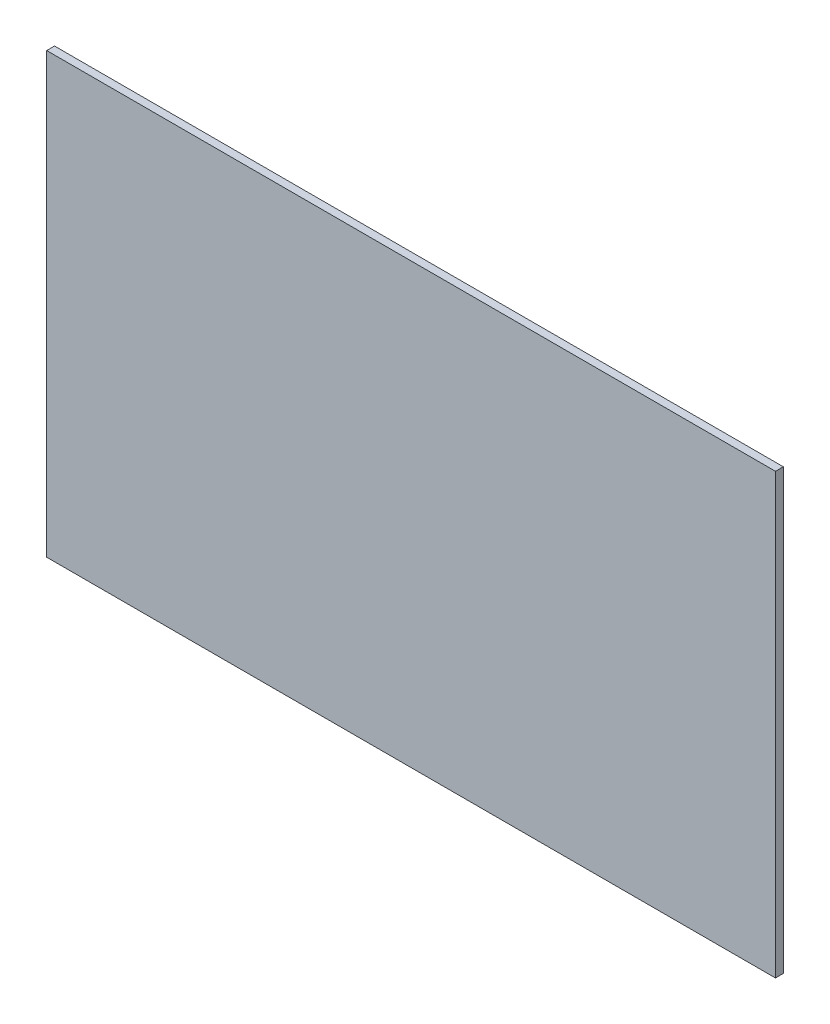
ISO-10303-21;
HEADER;
FILE_DESCRIPTION(('STEP AP214'),'2;1');
FILE_NAME('part.step','',(''),(''),'','','');
FILE_SCHEMA(('AUTOMOTIVE_DESIGN { 1 0 10303 214 1 1 1 1 }'));
ENDSEC;
DATA;
#1=APPLICATION_CONTEXT('core data for automotive mechanical design processes');
#2=APPLICATION_PROTOCOL_DEFINITION('international standard','automotive_design',2000,#1);
#3=PRODUCT_CONTEXT('',#1,'mechanical');
#4=PRODUCT('Part','Part','',(#3));
#5=PRODUCT_RELATED_PRODUCT_CATEGORY('part','',(#4));
#6=PRODUCT_DEFINITION_FORMATION('','',#4);
#7=PRODUCT_DEFINITION_CONTEXT('part definition',#1,'design');
#8=PRODUCT_DEFINITION('design','',#6,#7);
#9=PRODUCT_DEFINITION_SHAPE('','',#8);
#10=(LENGTH_UNIT() NAMED_UNIT(*) SI_UNIT(.MILLI.,.METRE.));
#11=(NAMED_UNIT(*) PLANE_ANGLE_UNIT() SI_UNIT($,.RADIAN.));
#12=(NAMED_UNIT(*) SI_UNIT($,.STERADIAN.) SOLID_ANGLE_UNIT());
#13=UNCERTAINTY_MEASURE_WITH_UNIT(LENGTH_MEASURE(1.E-05),#10,'distance_accuracy_value','');
#14=(GEOMETRIC_REPRESENTATION_CONTEXT(3) GLOBAL_UNCERTAINTY_ASSIGNED_CONTEXT((#13)) GLOBAL_UNIT_ASSIGNED_CONTEXT((#10,
#11,#12)) REPRESENTATION_CONTEXT('',''));
#15=CARTESIAN_POINT('',(0.,0.,0.));
#16=DIRECTION('',(0.,0.,1.));
#17=DIRECTION('',(1.,0.,0.));
#18=AXIS2_PLACEMENT_3D('',#15,#16,#17);
#19=CARTESIAN_POINT('',(0.,0.,5.));
#20=DIRECTION('',(1.,0.,0.));
#21=DIRECTION('',(0.,0.,-1.));
#22=AXIS2_PLACEMENT_3D('',#19,#20,#21);
#23=PLANE('',#22);
#24=DIRECTION('',(0.,-1.,0.));
#25=VECTOR('',#24,1.);
#26=CARTESIAN_POINT('',(0.,0.,0.));
#27=LINE('',#26,#25);
#28=CARTESIAN_POINT('',(0.,280.,0.));
#29=VERTEX_POINT('',#28);
#30=CARTESIAN_POINT('',(0.,0.,0.));
#31=VERTEX_POINT('',#30);
#32=EDGE_CURVE('E96',#29,#31,#27,.T.);
#33=ORIENTED_EDGE('',*,*,#32,.T.);
#34=DIRECTION('',(0.,0.,-1.));
#35=VECTOR('',#34,1.);
#36=CARTESIAN_POINT('',(0.,0.,5.));
#37=LINE('',#36,#35);
#38=CARTESIAN_POINT('',(0.,0.,5.));
#39=VERTEX_POINT('',#38);
#40=EDGE_CURVE('E11',#39,#31,#37,.T.);
#41=ORIENTED_EDGE('',*,*,#40,.F.);
#42=DIRECTION('',(0.,-1.,0.));
#43=VECTOR('',#42,1.);
#44=CARTESIAN_POINT('',(0.,0.,5.));
#45=LINE('',#44,#43);
#46=CARTESIAN_POINT('',(0.,280.,5.));
#47=VERTEX_POINT('',#46);
#48=EDGE_CURVE('E84',#47,#39,#45,.T.);
#49=ORIENTED_EDGE('',*,*,#48,.F.);
#50=DIRECTION('',(0.,0.,-1.));
#51=VECTOR('',#50,1.);
#52=CARTESIAN_POINT('',(0.,280.,5.));
#53=LINE('',#52,#51);
#54=EDGE_CURVE('E92',#47,#29,#53,.T.);
#55=ORIENTED_EDGE('',*,*,#54,.T.);
#56=EDGE_LOOP('',(#33,#41,#49,#55));
#57=FACE_BOUND('',#56,.T.);
#58=ADVANCED_FACE('F33',(#57),#23,.F.);
#59=CARTESIAN_POINT('',(0.,0.,5.));
#60=DIRECTION('',(0.,1.,0.));
#61=DIRECTION('',(0.,0.,1.));
#62=AXIS2_PLACEMENT_3D('',#59,#60,#61);
#63=PLANE('',#62);
#64=DIRECTION('',(1.,0.,0.));
#65=VECTOR('',#64,1.);
#66=CARTESIAN_POINT('',(0.,0.,0.));
#67=LINE('',#66,#65);
#68=CARTESIAN_POINT('',(465.,0.,0.));
#69=VERTEX_POINT('',#68);
#70=EDGE_CURVE('E88',#31,#69,#67,.T.);
#71=ORIENTED_EDGE('',*,*,#70,.T.);
#72=DIRECTION('',(0.,0.,-1.));
#73=VECTOR('',#72,1.);
#74=CARTESIAN_POINT('',(465.,0.,5.));
#75=LINE('',#74,#73);
#76=CARTESIAN_POINT('',(465.,0.,5.));
#77=VERTEX_POINT('',#76);
#78=EDGE_CURVE('E41',#77,#69,#75,.T.);
#79=ORIENTED_EDGE('',*,*,#78,.F.);
#80=DIRECTION('',(1.,0.,0.));
#81=VECTOR('',#80,1.);
#82=CARTESIAN_POINT('',(0.,0.,5.));
#83=LINE('',#82,#81);
#84=EDGE_CURVE('E79',#39,#77,#83,.T.);
#85=ORIENTED_EDGE('',*,*,#84,.F.);
#86=ORIENTED_EDGE('',*,*,#40,.T.);
#87=EDGE_LOOP('',(#71,#79,#85,#86));
#88=FACE_BOUND('',#87,.T.);
#89=ADVANCED_FACE('F87',(#88),#63,.F.);
#90=CARTESIAN_POINT('',(465.,0.,5.));
#91=DIRECTION('',(-1.,0.,0.));
#92=DIRECTION('',(0.,0.,1.));
#93=AXIS2_PLACEMENT_3D('',#90,#91,#92);
#94=PLANE('',#93);
#95=DIRECTION('',(0.,1.,0.));
#96=VECTOR('',#95,1.);
#97=CARTESIAN_POINT('',(465.,0.,0.));
#98=LINE('',#97,#96);
#99=CARTESIAN_POINT('',(465.,280.,0.));
#100=VERTEX_POINT('',#99);
#101=EDGE_CURVE('E66',#69,#100,#98,.T.);
#102=ORIENTED_EDGE('',*,*,#101,.T.);
#103=DIRECTION('',(0.,0.,-1.));
#104=VECTOR('',#103,1.);
#105=CARTESIAN_POINT('',(465.,280.,5.));
#106=LINE('',#105,#104);
#107=CARTESIAN_POINT('',(465.,280.,5.));
#108=VERTEX_POINT('',#107);
#109=EDGE_CURVE('E89',#108,#100,#106,.T.);
#110=ORIENTED_EDGE('',*,*,#109,.F.);
#111=DIRECTION('',(0.,1.,0.));
#112=VECTOR('',#111,1.);
#113=CARTESIAN_POINT('',(465.,0.,5.));
#114=LINE('',#113,#112);
#115=EDGE_CURVE('E82',#77,#108,#114,.T.);
#116=ORIENTED_EDGE('',*,*,#115,.F.);
#117=ORIENTED_EDGE('',*,*,#78,.T.);
#118=EDGE_LOOP('',(#102,#110,#116,#117));
#119=FACE_BOUND('',#118,.T.);
#120=ADVANCED_FACE('F90',(#119),#94,.F.);
#121=CARTESIAN_POINT('',(0.,280.,5.));
#122=DIRECTION('',(0.,-1.,0.));
#123=DIRECTION('',(0.,0.,-1.));
#124=AXIS2_PLACEMENT_3D('',#121,#122,#123);
#125=PLANE('',#124);
#126=DIRECTION('',(-1.,0.,0.));
#127=VECTOR('',#126,1.);
#128=CARTESIAN_POINT('',(0.,280.,0.));
#129=LINE('',#128,#127);
#130=EDGE_CURVE('E72',#100,#29,#129,.T.);
#131=ORIENTED_EDGE('',*,*,#130,.T.);
#132=ORIENTED_EDGE('',*,*,#54,.F.);
#133=DIRECTION('',(-1.,0.,0.));
#134=VECTOR('',#133,1.);
#135=CARTESIAN_POINT('',(0.,280.,5.));
#136=LINE('',#135,#134);
#137=EDGE_CURVE('E49',#108,#47,#136,.T.);
#138=ORIENTED_EDGE('',*,*,#137,.F.);
#139=ORIENTED_EDGE('',*,*,#109,.T.);
#140=EDGE_LOOP('',(#131,#132,#138,#139));
#141=FACE_BOUND('',#140,.T.);
#142=ADVANCED_FACE('F103',(#141),#125,.F.);
#143=CARTESIAN_POINT('',(0.,0.,5.));
#144=DIRECTION('',(0.,0.,-1.));
#145=DIRECTION('',(-1.,0.,0.));
#146=AXIS2_PLACEMENT_3D('',#143,#144,#145);
#147=PLANE('',#146);
#148=ORIENTED_EDGE('',*,*,#48,.T.);
#149=ORIENTED_EDGE('',*,*,#84,.T.);
#150=ORIENTED_EDGE('',*,*,#115,.T.);
#151=ORIENTED_EDGE('',*,*,#137,.T.);
#152=EDGE_LOOP('',(#148,#149,#150,#151));
#153=FACE_BOUND('',#152,.T.);
#154=ADVANCED_FACE('F80',(#153),#147,.F.);
#155=CARTESIAN_POINT('',(0.,0.,0.));
#156=DIRECTION('',(0.,0.,-1.));
#157=DIRECTION('',(-1.,0.,0.));
#158=AXIS2_PLACEMENT_3D('',#155,#156,#157);
#159=PLANE('',#158);
#160=ORIENTED_EDGE('',*,*,#32,.F.);
#161=ORIENTED_EDGE('',*,*,#130,.F.);
#162=ORIENTED_EDGE('',*,*,#101,.F.);
#163=ORIENTED_EDGE('',*,*,#70,.F.);
#164=EDGE_LOOP('',(#160,#161,#162,#163));
#165=FACE_BOUND('',#164,.T.);
#166=ADVANCED_FACE('F106',(#165),#159,.T.);
#167=CLOSED_SHELL('',(#58,#89,#120,#142,#154,#166));
#168=MANIFOLD_SOLID_BREP('B2',#167);
#169=ADVANCED_BREP_SHAPE_REPRESENTATION('',(#18,#168),#14);
#170=SHAPE_DEFINITION_REPRESENTATION(#9,#169);
ENDSEC;
END-ISO-10303-21;
